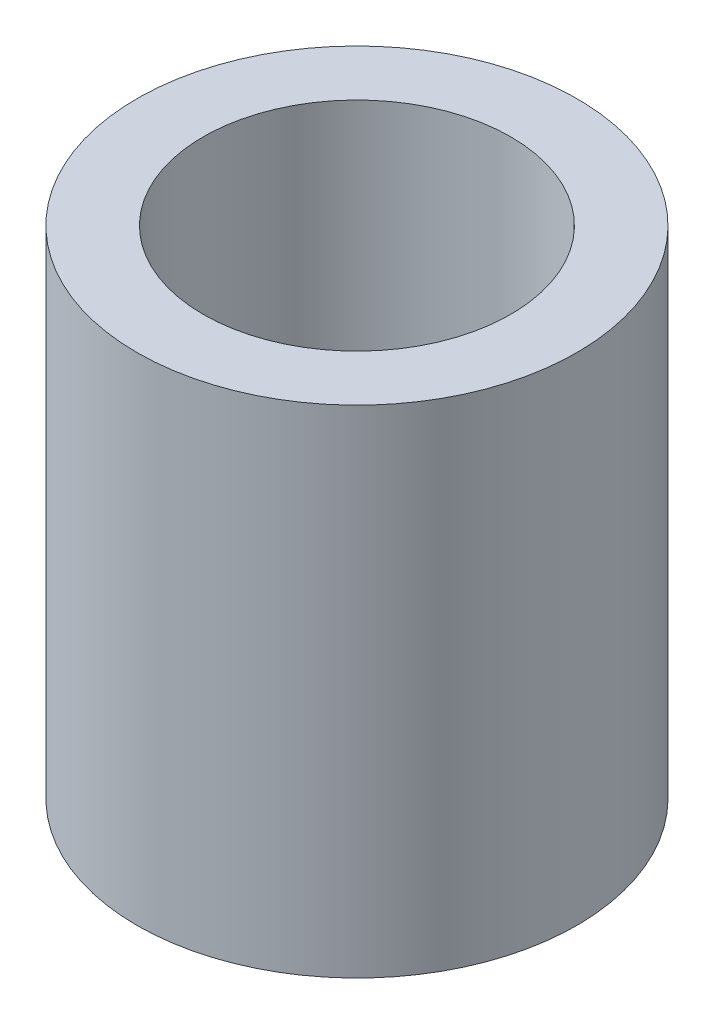
ISO-10303-21;
HEADER;
FILE_DESCRIPTION(('STEP AP214'),'2;1');
FILE_NAME('part.step','',(''),(''),'','','');
FILE_SCHEMA(('AUTOMOTIVE_DESIGN { 1 0 10303 214 1 1 1 1 }'));
ENDSEC;
DATA;
#1=APPLICATION_CONTEXT('core data for automotive mechanical design processes');
#2=APPLICATION_PROTOCOL_DEFINITION('international standard','automotive_design',2000,#1);
#3=PRODUCT_CONTEXT('',#1,'mechanical');
#4=PRODUCT('Part','Part','',(#3));
#5=PRODUCT_RELATED_PRODUCT_CATEGORY('part','',(#4));
#6=PRODUCT_DEFINITION_FORMATION('','',#4);
#7=PRODUCT_DEFINITION_CONTEXT('part definition',#1,'design');
#8=PRODUCT_DEFINITION('design','',#6,#7);
#9=PRODUCT_DEFINITION_SHAPE('','',#8);
#10=(LENGTH_UNIT() NAMED_UNIT(*) SI_UNIT(.MILLI.,.METRE.));
#11=(NAMED_UNIT(*) PLANE_ANGLE_UNIT() SI_UNIT($,.RADIAN.));
#12=(NAMED_UNIT(*) SI_UNIT($,.STERADIAN.) SOLID_ANGLE_UNIT());
#13=UNCERTAINTY_MEASURE_WITH_UNIT(LENGTH_MEASURE(1.E-05),#10,'distance_accuracy_value','');
#14=(GEOMETRIC_REPRESENTATION_CONTEXT(3) GLOBAL_UNCERTAINTY_ASSIGNED_CONTEXT((#13)) GLOBAL_UNIT_ASSIGNED_CONTEXT((#10,
#11,#12)) REPRESENTATION_CONTEXT('',''));
#15=CARTESIAN_POINT('',(0.,0.,0.));
#16=DIRECTION('',(0.,0.,1.));
#17=DIRECTION('',(1.,0.,0.));
#18=AXIS2_PLACEMENT_3D('',#15,#16,#17);
#19=CARTESIAN_POINT('',(0.,15.,0.));
#20=DIRECTION('',(0.,1.,0.));
#21=DIRECTION('',(0.,0.,1.));
#22=AXIS2_PLACEMENT_3D('',#19,#20,#21);
#23=PLANE('',#22);
#24=CARTESIAN_POINT('',(0.,15.,0.));
#25=DIRECTION('',(0.,1.,0.));
#26=DIRECTION('',(0.,0.,1.));
#27=AXIS2_PLACEMENT_3D('',#24,#25,#26);
#28=CIRCLE('',#27,6.65);
#29=CARTESIAN_POINT('',(0.,15.,6.65));
#30=VERTEX_POINT('',#29);
#31=EDGE_CURVE('E10',#30,#30,#28,.T.);
#32=ORIENTED_EDGE('',*,*,#31,.T.);
#33=EDGE_LOOP('',(#32));
#34=FACE_BOUND('',#33,.T.);
#35=CARTESIAN_POINT('',(0.,15.,0.));
#36=DIRECTION('',(0.,1.,0.));
#37=DIRECTION('',(0.,0.,1.));
#38=AXIS2_PLACEMENT_3D('',#35,#36,#37);
#39=CIRCLE('',#38,4.65);
#40=CARTESIAN_POINT('',(0.,15.,4.65));
#41=VERTEX_POINT('',#40);
#42=EDGE_CURVE('E46',#41,#41,#39,.T.);
#43=ORIENTED_EDGE('',*,*,#42,.F.);
#44=EDGE_LOOP('',(#43));
#45=FACE_BOUND('',#44,.T.);
#46=ADVANCED_FACE('F35',(#34,#45),#23,.T.);
#47=CARTESIAN_POINT('',(0.,0.,0.));
#48=DIRECTION('',(0.,1.,0.));
#49=DIRECTION('',(0.,0.,1.));
#50=AXIS2_PLACEMENT_3D('',#47,#48,#49);
#51=PLANE('',#50);
#52=CARTESIAN_POINT('',(0.,0.,0.));
#53=DIRECTION('',(0.,1.,0.));
#54=DIRECTION('',(0.,0.,1.));
#55=AXIS2_PLACEMENT_3D('',#52,#53,#54);
#56=CIRCLE('',#55,6.65);
#57=CARTESIAN_POINT('',(0.,0.,6.65));
#58=VERTEX_POINT('',#57);
#59=EDGE_CURVE('E39',#58,#58,#56,.T.);
#60=ORIENTED_EDGE('',*,*,#59,.F.);
#61=EDGE_LOOP('',(#60));
#62=FACE_BOUND('',#61,.T.);
#63=CARTESIAN_POINT('',(0.,0.,0.));
#64=DIRECTION('',(0.,1.,0.));
#65=DIRECTION('',(0.,0.,1.));
#66=AXIS2_PLACEMENT_3D('',#63,#64,#65);
#67=CIRCLE('',#66,4.65);
#68=CARTESIAN_POINT('',(0.,0.,4.65));
#69=VERTEX_POINT('',#68);
#70=EDGE_CURVE('E48',#69,#69,#67,.T.);
#71=ORIENTED_EDGE('',*,*,#70,.T.);
#72=EDGE_LOOP('',(#71));
#73=FACE_BOUND('',#72,.T.);
#74=ADVANCED_FACE('F58',(#62,#73),#51,.F.);
#75=CARTESIAN_POINT('',(0.,15.,0.));
#76=DIRECTION('',(0.,-1.,0.));
#77=DIRECTION('',(0.,0.,-1.));
#78=AXIS2_PLACEMENT_3D('',#75,#76,#77);
#79=CYLINDRICAL_SURFACE('',#78,6.65);
#80=ORIENTED_EDGE('',*,*,#31,.F.);
#81=EDGE_LOOP('',(#80));
#82=FACE_BOUND('',#81,.T.);
#83=ORIENTED_EDGE('',*,*,#59,.T.);
#84=EDGE_LOOP('',(#83));
#85=FACE_BOUND('',#84,.T.);
#86=ADVANCED_FACE('F37',(#82,#85),#79,.T.);
#87=CARTESIAN_POINT('',(0.,15.,0.));
#88=DIRECTION('',(0.,-1.,0.));
#89=DIRECTION('',(0.,0.,-1.));
#90=AXIS2_PLACEMENT_3D('',#87,#88,#89);
#91=CYLINDRICAL_SURFACE('',#90,4.65);
#92=ORIENTED_EDGE('',*,*,#42,.T.);
#93=EDGE_LOOP('',(#92));
#94=FACE_BOUND('',#93,.T.);
#95=ORIENTED_EDGE('',*,*,#70,.F.);
#96=EDGE_LOOP('',(#95));
#97=FACE_BOUND('',#96,.T.);
#98=ADVANCED_FACE('F54',(#94,#97),#91,.F.);
#99=CLOSED_SHELL('',(#46,#74,#86,#98));
#100=MANIFOLD_SOLID_BREP('B2',#99);
#101=ADVANCED_BREP_SHAPE_REPRESENTATION('',(#18,#100),#14);
#102=SHAPE_DEFINITION_REPRESENTATION(#9,#101);
ENDSEC;
END-ISO-10303-21;
